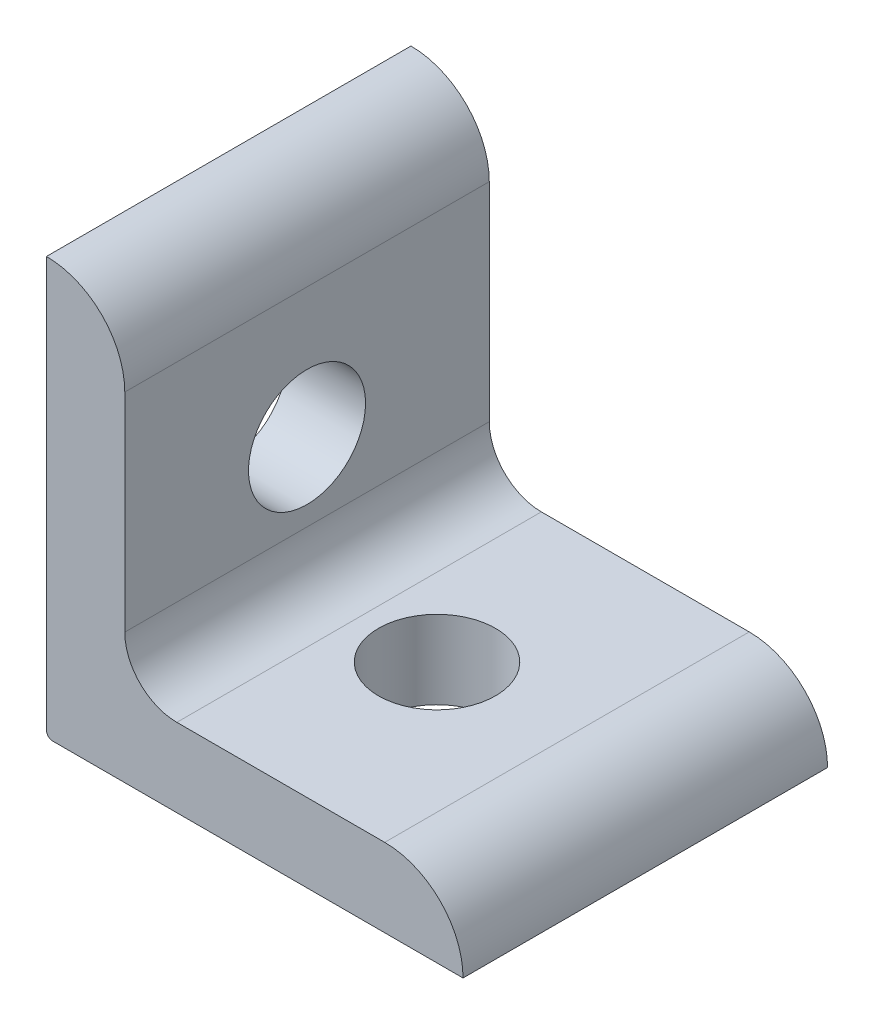
ISO-10303-21;
HEADER;
FILE_DESCRIPTION(('STEP AP214'),'2;1');
FILE_NAME('part.step','',(''),(''),'','','');
FILE_SCHEMA(('AUTOMOTIVE_DESIGN { 1 0 10303 214 1 1 1 1 }'));
ENDSEC;
DATA;
#1=APPLICATION_CONTEXT('core data for automotive mechanical design processes');
#2=APPLICATION_PROTOCOL_DEFINITION('international standard','automotive_design',2000,#1);
#3=PRODUCT_CONTEXT('',#1,'mechanical');
#4=PRODUCT('Part','Part','',(#3));
#5=PRODUCT_RELATED_PRODUCT_CATEGORY('part','',(#4));
#6=PRODUCT_DEFINITION_FORMATION('','',#4);
#7=PRODUCT_DEFINITION_CONTEXT('part definition',#1,'design');
#8=PRODUCT_DEFINITION('design','',#6,#7);
#9=PRODUCT_DEFINITION_SHAPE('','',#8);
#10=(LENGTH_UNIT() NAMED_UNIT(*) SI_UNIT(.MILLI.,.METRE.));
#11=(NAMED_UNIT(*) PLANE_ANGLE_UNIT() SI_UNIT($,.RADIAN.));
#12=(NAMED_UNIT(*) SI_UNIT($,.STERADIAN.) SOLID_ANGLE_UNIT());
#13=UNCERTAINTY_MEASURE_WITH_UNIT(LENGTH_MEASURE(1.E-05),#10,'distance_accuracy_value','');
#14=(GEOMETRIC_REPRESENTATION_CONTEXT(3) GLOBAL_UNCERTAINTY_ASSIGNED_CONTEXT((#13)) GLOBAL_UNIT_ASSIGNED_CONTEXT((#10,
#11,#12)) REPRESENTATION_CONTEXT('',''));
#15=CARTESIAN_POINT('',(0.,0.,0.));
#16=DIRECTION('',(0.,0.,1.));
#17=DIRECTION('',(1.,0.,0.));
#18=AXIS2_PLACEMENT_3D('',#15,#16,#17);
#19=CARTESIAN_POINT('',(20.6248,-9.25533389722021E-11,0.));
#20=DIRECTION('',(0.,0.,-1.));
#21=DIRECTION('',(-1.,0.,0.));
#22=AXIS2_PLACEMENT_3D('',#19,#20,#21);
#23=CYLINDRICAL_SURFACE('',#22,4.7752);
#24=CARTESIAN_POINT('',(20.6248,-9.25533389722021E-11,-22.225));
#25=DIRECTION('',(0.,0.,-1.));
#26=DIRECTION('',(-1.,0.,0.));
#27=AXIS2_PLACEMENT_3D('',#24,#25,#26);
#28=CIRCLE('',#27,4.7752);
#29=CARTESIAN_POINT('',(20.6248,4.77519999990745,-22.225));
#30=VERTEX_POINT('',#29);
#31=CARTESIAN_POINT('',(25.4,-9.25533389722021E-11,-22.225));
#32=VERTEX_POINT('',#31);
#33=EDGE_CURVE('E138',#30,#32,#28,.T.);
#34=ORIENTED_EDGE('',*,*,#33,.F.);
#35=DIRECTION('',(0.,0.,-1.));
#36=VECTOR('',#35,1.);
#37=CARTESIAN_POINT('',(20.6248,4.77519999990745,0.));
#38=LINE('',#37,#36);
#39=CARTESIAN_POINT('',(20.6248,4.77519999990745,0.));
#40=VERTEX_POINT('',#39);
#41=EDGE_CURVE('E121',#40,#30,#38,.T.);
#42=ORIENTED_EDGE('',*,*,#41,.F.);
#43=CARTESIAN_POINT('',(20.6248,-9.25533389722021E-11,0.));
#44=DIRECTION('',(0.,0.,-1.));
#45=DIRECTION('',(-1.,0.,0.));
#46=AXIS2_PLACEMENT_3D('',#43,#44,#45);
#47=CIRCLE('',#46,4.7752);
#48=CARTESIAN_POINT('',(25.4,-9.25533389722021E-11,0.));
#49=VERTEX_POINT('',#48);
#50=EDGE_CURVE('E114',#40,#49,#47,.T.);
#51=ORIENTED_EDGE('',*,*,#50,.T.);
#52=DIRECTION('',(0.,0.,-1.));
#53=VECTOR('',#52,1.);
#54=CARTESIAN_POINT('',(25.4,-9.25533389722021E-11,0.));
#55=LINE('',#54,#53);
#56=EDGE_CURVE('E95',#49,#32,#55,.T.);
#57=ORIENTED_EDGE('',*,*,#56,.T.);
#58=EDGE_LOOP('',(#34,#42,#51,#57));
#59=FACE_BOUND('',#58,.T.);
#60=ADVANCED_FACE('F32',(#59),#23,.T.);
#61=CARTESIAN_POINT('',(4.77520000003089,4.77519999990745,0.));
#62=DIRECTION('',(0.,1.,0.));
#63=DIRECTION('',(-1.,0.,0.));
#64=AXIS2_PLACEMENT_3D('',#61,#62,#63);
#65=PLANE('',#64);
#66=CARTESIAN_POINT('',(12.7,4.77519999990745,-11.1125));
#67=DIRECTION('',(0.,1.,0.));
#68=DIRECTION('',(0.,0.,1.));
#69=AXIS2_PLACEMENT_3D('',#66,#67,#68);
#70=CIRCLE('',#69,3.56870000000001);
#71=CARTESIAN_POINT('',(12.7,4.77519999990745,-7.54379999999999));
#72=VERTEX_POINT('',#71);
#73=EDGE_CURVE('E224',#72,#72,#70,.T.);
#74=ORIENTED_EDGE('',*,*,#73,.F.);
#75=EDGE_LOOP('',(#74));
#76=FACE_BOUND('',#75,.T.);
#77=DIRECTION('',(1.,0.,0.));
#78=VECTOR('',#77,1.);
#79=CARTESIAN_POINT('',(4.77520000003089,4.77519999990745,-22.225));
#80=LINE('',#79,#78);
#81=CARTESIAN_POINT('',(7.95020000003089,4.77519999990745,-22.225));
#82=VERTEX_POINT('',#81);
#83=EDGE_CURVE('E122',#82,#30,#80,.T.);
#84=ORIENTED_EDGE('',*,*,#83,.F.);
#85=DIRECTION('',(0.,0.,-1.));
#86=VECTOR('',#85,1.);
#87=CARTESIAN_POINT('',(7.95020000003089,4.77519999990745,0.));
#88=LINE('',#87,#86);
#89=CARTESIAN_POINT('',(7.95020000003089,4.77519999990745,0.));
#90=VERTEX_POINT('',#89);
#91=EDGE_CURVE('E47',#82,#90,#88,.F.);
#92=ORIENTED_EDGE('',*,*,#91,.T.);
#93=DIRECTION('',(1.,0.,0.));
#94=VECTOR('',#93,1.);
#95=CARTESIAN_POINT('',(4.77520000003089,4.77519999990745,0.));
#96=LINE('',#95,#94);
#97=EDGE_CURVE('E108',#90,#40,#96,.T.);
#98=ORIENTED_EDGE('',*,*,#97,.T.);
#99=ORIENTED_EDGE('',*,*,#41,.T.);
#100=EDGE_LOOP('',(#84,#92,#98,#99));
#101=FACE_BOUND('',#100,.T.);
#102=ADVANCED_FACE('F184',(#76,#101),#65,.T.);
#103=CARTESIAN_POINT('',(4.77520000003089,20.6247999999691,0.));
#104=DIRECTION('',(1.,0.,0.));
#105=DIRECTION('',(0.,1.,0.));
#106=AXIS2_PLACEMENT_3D('',#103,#104,#105);
#107=PLANE('',#106);
#108=CARTESIAN_POINT('',(4.77520000003089,12.6999999999691,-11.1125));
#109=DIRECTION('',(1.,0.,0.));
#110=DIRECTION('',(0.,0.,-1.));
#111=AXIS2_PLACEMENT_3D('',#108,#109,#110);
#112=CIRCLE('',#111,3.56870000000001);
#113=CARTESIAN_POINT('',(4.77520000003089,12.6999999999691,-14.6812));
#114=VERTEX_POINT('',#113);
#115=EDGE_CURVE('E222',#114,#114,#112,.T.);
#116=ORIENTED_EDGE('',*,*,#115,.F.);
#117=EDGE_LOOP('',(#116));
#118=FACE_BOUND('',#117,.T.);
#119=DIRECTION('',(0.,-1.,0.));
#120=VECTOR('',#119,1.);
#121=CARTESIAN_POINT('',(4.77520000003089,20.6247999999691,0.));
#122=LINE('',#121,#120);
#123=CARTESIAN_POINT('',(4.77520000003089,20.6247999999691,0.));
#124=VERTEX_POINT('',#123);
#125=CARTESIAN_POINT('',(4.77520000003089,7.95019999990745,0.));
#126=VERTEX_POINT('',#125);
#127=EDGE_CURVE('E134',#124,#126,#122,.T.);
#128=ORIENTED_EDGE('',*,*,#127,.T.);
#129=DIRECTION('',(0.,0.,-1.));
#130=VECTOR('',#129,1.);
#131=CARTESIAN_POINT('',(4.77520000003089,7.95019999990745,-22.225));
#132=LINE('',#131,#130);
#133=CARTESIAN_POINT('',(4.77520000003089,7.95019999990745,-22.225));
#134=VERTEX_POINT('',#133);
#135=EDGE_CURVE('E159',#126,#134,#132,.T.);
#136=ORIENTED_EDGE('',*,*,#135,.T.);
#137=DIRECTION('',(0.,-1.,0.));
#138=VECTOR('',#137,1.);
#139=CARTESIAN_POINT('',(4.77520000003089,20.6247999999691,-22.225));
#140=LINE('',#139,#138);
#141=CARTESIAN_POINT('',(4.77520000003089,20.6247999999691,-22.225));
#142=VERTEX_POINT('',#141);
#143=EDGE_CURVE('E124',#142,#134,#140,.T.);
#144=ORIENTED_EDGE('',*,*,#143,.F.);
#145=DIRECTION('',(0.,0.,-1.));
#146=VECTOR('',#145,1.);
#147=CARTESIAN_POINT('',(4.77520000003089,20.6247999999691,0.));
#148=LINE('',#147,#146);
#149=EDGE_CURVE('E149',#124,#142,#148,.T.);
#150=ORIENTED_EDGE('',*,*,#149,.F.);
#151=EDGE_LOOP('',(#128,#136,#144,#150));
#152=FACE_BOUND('',#151,.T.);
#153=ADVANCED_FACE('F165',(#118,#152),#107,.T.);
#154=CARTESIAN_POINT('',(3.08890018003394E-11,20.6247999999691,0.));
#155=DIRECTION('',(0.,0.,-1.));
#156=DIRECTION('',(-1.,0.,0.));
#157=AXIS2_PLACEMENT_3D('',#154,#155,#156);
#158=CYLINDRICAL_SURFACE('',#157,4.7752);
#159=CARTESIAN_POINT('',(3.08890018003394E-11,20.6247999999691,-22.225));
#160=DIRECTION('',(0.,0.,-1.));
#161=DIRECTION('',(-1.,0.,0.));
#162=AXIS2_PLACEMENT_3D('',#159,#160,#161);
#163=CIRCLE('',#162,4.7752);
#164=CARTESIAN_POINT('',(3.08890018003394E-11,25.3999999999691,-22.225));
#165=VERTEX_POINT('',#164);
#166=EDGE_CURVE('E143',#165,#142,#163,.T.);
#167=ORIENTED_EDGE('',*,*,#166,.F.);
#168=DIRECTION('',(0.,0.,-1.));
#169=VECTOR('',#168,1.);
#170=CARTESIAN_POINT('',(3.08890018003394E-11,25.3999999999691,0.));
#171=LINE('',#170,#169);
#172=CARTESIAN_POINT('',(3.08890018003394E-11,25.3999999999691,0.));
#173=VERTEX_POINT('',#172);
#174=EDGE_CURVE('E107',#173,#165,#171,.T.);
#175=ORIENTED_EDGE('',*,*,#174,.F.);
#176=CARTESIAN_POINT('',(3.08890018003394E-11,20.6247999999691,0.));
#177=DIRECTION('',(0.,0.,-1.));
#178=DIRECTION('',(-1.,0.,0.));
#179=AXIS2_PLACEMENT_3D('',#176,#177,#178);
#180=CIRCLE('',#179,4.7752);
#181=EDGE_CURVE('E131',#173,#124,#180,.T.);
#182=ORIENTED_EDGE('',*,*,#181,.T.);
#183=ORIENTED_EDGE('',*,*,#149,.T.);
#184=EDGE_LOOP('',(#167,#175,#182,#183));
#185=FACE_BOUND('',#184,.T.);
#186=ADVANCED_FACE('F174',(#185),#158,.T.);
#187=CARTESIAN_POINT('',(3.0888486213243E-11,-9.25533389722021E-11,0.));
#188=DIRECTION('',(-1.,0.,0.));
#189=DIRECTION('',(0.,-1.,0.));
#190=AXIS2_PLACEMENT_3D('',#187,#188,#189);
#191=PLANE('',#190);
#192=CARTESIAN_POINT('',(3.0887618851505E-11,12.6999999999691,-11.1125));
#193=DIRECTION('',(1.,0.,0.));
#194=DIRECTION('',(0.,0.,-1.));
#195=AXIS2_PLACEMENT_3D('',#192,#193,#194);
#196=CIRCLE('',#195,3.56870000000001);
#197=CARTESIAN_POINT('',(3.0887618851505E-11,12.6999999999691,-14.6812));
#198=VERTEX_POINT('',#197);
#199=EDGE_CURVE('E219',#198,#198,#196,.T.);
#200=ORIENTED_EDGE('',*,*,#199,.T.);
#201=EDGE_LOOP('',(#200));
#202=FACE_BOUND('',#201,.T.);
#203=DIRECTION('',(0.,1.,0.));
#204=VECTOR('',#203,1.);
#205=CARTESIAN_POINT('',(3.0888486213243E-11,-9.25533389722021E-11,-22.225));
#206=LINE('',#205,#204);
#207=CARTESIAN_POINT('',(3.08884939470495E-11,0.380999999907447,-22.225));
#208=VERTEX_POINT('',#207);
#209=EDGE_CURVE('E141',#208,#165,#206,.T.);
#210=ORIENTED_EDGE('',*,*,#209,.F.);
#211=DIRECTION('',(0.,0.,-1.));
#212=VECTOR('',#211,1.);
#213=CARTESIAN_POINT('',(3.08884939470495E-11,0.380999999907447,0.));
#214=LINE('',#213,#212);
#215=CARTESIAN_POINT('',(3.08884939470495E-11,0.380999999907447,0.));
#216=VERTEX_POINT('',#215);
#217=EDGE_CURVE('E156',#208,#216,#214,.F.);
#218=ORIENTED_EDGE('',*,*,#217,.T.);
#219=DIRECTION('',(0.,1.,0.));
#220=VECTOR('',#219,1.);
#221=CARTESIAN_POINT('',(3.0888486213243E-11,-9.25533389722021E-11,0.));
#222=LINE('',#221,#220);
#223=EDGE_CURVE('E117',#216,#173,#222,.T.);
#224=ORIENTED_EDGE('',*,*,#223,.T.);
#225=ORIENTED_EDGE('',*,*,#174,.T.);
#226=EDGE_LOOP('',(#210,#218,#224,#225));
#227=FACE_BOUND('',#226,.T.);
#228=ADVANCED_FACE('F194',(#202,#227),#191,.T.);
#229=CARTESIAN_POINT('',(25.4,-9.25533389722021E-11,0.));
#230=DIRECTION('',(0.,-1.,0.));
#231=DIRECTION('',(0.,0.,-1.));
#232=AXIS2_PLACEMENT_3D('',#229,#230,#231);
#233=PLANE('',#232);
#234=CARTESIAN_POINT('',(12.7,-9.25535689755286E-11,-11.1125));
#235=DIRECTION('',(0.,1.,0.));
#236=DIRECTION('',(0.,0.,1.));
#237=AXIS2_PLACEMENT_3D('',#234,#235,#236);
#238=CIRCLE('',#237,3.56870000000001);
#239=CARTESIAN_POINT('',(12.7,-9.25535689755286E-11,-7.54379999999999));
#240=VERTEX_POINT('',#239);
#241=EDGE_CURVE('E127',#240,#240,#238,.T.);
#242=ORIENTED_EDGE('',*,*,#241,.T.);
#243=EDGE_LOOP('',(#242));
#244=FACE_BOUND('',#243,.T.);
#245=DIRECTION('',(-1.,0.,0.));
#246=VECTOR('',#245,1.);
#247=CARTESIAN_POINT('',(25.4,-9.25533389722021E-11,0.));
#248=LINE('',#247,#246);
#249=CARTESIAN_POINT('',(0.381000000030888,-9.25533389722021E-11,0.));
#250=VERTEX_POINT('',#249);
#251=EDGE_CURVE('E99',#49,#250,#248,.T.);
#252=ORIENTED_EDGE('',*,*,#251,.T.);
#253=DIRECTION('',(0.,0.,-1.));
#254=VECTOR('',#253,1.);
#255=CARTESIAN_POINT('',(0.381000000030888,-9.25533389722021E-11,0.));
#256=LINE('',#255,#254);
#257=CARTESIAN_POINT('',(0.381000000030888,-9.25533389722021E-11,-22.225));
#258=VERTEX_POINT('',#257);
#259=EDGE_CURVE('E148',#250,#258,#256,.T.);
#260=ORIENTED_EDGE('',*,*,#259,.T.);
#261=DIRECTION('',(-1.,0.,0.));
#262=VECTOR('',#261,1.);
#263=CARTESIAN_POINT('',(25.4,-9.25533389722021E-11,-22.225));
#264=LINE('',#263,#262);
#265=EDGE_CURVE('E102',#32,#258,#264,.T.);
#266=ORIENTED_EDGE('',*,*,#265,.F.);
#267=ORIENTED_EDGE('',*,*,#56,.F.);
#268=EDGE_LOOP('',(#252,#260,#266,#267));
#269=FACE_BOUND('',#268,.T.);
#270=ADVANCED_FACE('F97',(#244,#269),#233,.T.);
#271=CARTESIAN_POINT('',(20.6248,-9.25533389722021E-11,0.));
#272=DIRECTION('',(0.,0.,-1.));
#273=DIRECTION('',(-1.,0.,0.));
#274=AXIS2_PLACEMENT_3D('',#271,#272,#273);
#275=PLANE('',#274);
#276=ORIENTED_EDGE('',*,*,#223,.F.);
#277=CARTESIAN_POINT('',(0.381000000030888,0.380999999907447,0.));
#278=DIRECTION('',(0.,0.,-1.));
#279=DIRECTION('',(-1.,0.,0.));
#280=AXIS2_PLACEMENT_3D('',#277,#278,#279);
#281=CIRCLE('',#280,0.381);
#282=EDGE_CURVE('E116',#216,#250,#281,.F.);
#283=ORIENTED_EDGE('',*,*,#282,.T.);
#284=ORIENTED_EDGE('',*,*,#251,.F.);
#285=ORIENTED_EDGE('',*,*,#50,.F.);
#286=ORIENTED_EDGE('',*,*,#97,.F.);
#287=CARTESIAN_POINT('',(7.95020000003089,7.95019999990745,0.));
#288=DIRECTION('',(0.,0.,-1.));
#289=DIRECTION('',(-1.,0.,0.));
#290=AXIS2_PLACEMENT_3D('',#287,#288,#289);
#291=CIRCLE('',#290,3.175);
#292=EDGE_CURVE('E11',#90,#126,#291,.T.);
#293=ORIENTED_EDGE('',*,*,#292,.T.);
#294=ORIENTED_EDGE('',*,*,#127,.F.);
#295=ORIENTED_EDGE('',*,*,#181,.F.);
#296=EDGE_LOOP('',(#276,#283,#284,#285,#286,#293,#294,#295));
#297=FACE_BOUND('',#296,.T.);
#298=ADVANCED_FACE('F113',(#297),#275,.F.);
#299=CARTESIAN_POINT('',(20.6248,-9.25533389722021E-11,-22.225));
#300=DIRECTION('',(0.,0.,-1.));
#301=DIRECTION('',(-1.,0.,0.));
#302=AXIS2_PLACEMENT_3D('',#299,#300,#301);
#303=PLANE('',#302);
#304=ORIENTED_EDGE('',*,*,#265,.T.);
#305=CARTESIAN_POINT('',(0.381000000030888,0.380999999907447,-22.225));
#306=DIRECTION('',(0.,0.,-1.));
#307=DIRECTION('',(-1.,0.,0.));
#308=AXIS2_PLACEMENT_3D('',#305,#306,#307);
#309=CIRCLE('',#308,0.381);
#310=EDGE_CURVE('E154',#258,#208,#309,.T.);
#311=ORIENTED_EDGE('',*,*,#310,.T.);
#312=ORIENTED_EDGE('',*,*,#209,.T.);
#313=ORIENTED_EDGE('',*,*,#166,.T.);
#314=ORIENTED_EDGE('',*,*,#143,.T.);
#315=CARTESIAN_POINT('',(7.95020000003089,7.95019999990745,-22.225));
#316=DIRECTION('',(0.,0.,-1.));
#317=DIRECTION('',(-1.,0.,0.));
#318=AXIS2_PLACEMENT_3D('',#315,#316,#317);
#319=CIRCLE('',#318,3.175);
#320=EDGE_CURVE('E40',#134,#82,#319,.F.);
#321=ORIENTED_EDGE('',*,*,#320,.T.);
#322=ORIENTED_EDGE('',*,*,#83,.T.);
#323=ORIENTED_EDGE('',*,*,#33,.T.);
#324=EDGE_LOOP('',(#304,#311,#312,#313,#314,#321,#322,#323));
#325=FACE_BOUND('',#324,.T.);
#326=ADVANCED_FACE('F169',(#325),#303,.T.);
#327=CARTESIAN_POINT('',(12.7,4.77519999990745,-11.1125));
#328=DIRECTION('',(0.,1.,0.));
#329=DIRECTION('',(0.,0.,1.));
#330=AXIS2_PLACEMENT_3D('',#327,#328,#329);
#331=CYLINDRICAL_SURFACE('',#330,3.56870000000001);
#332=ORIENTED_EDGE('',*,*,#241,.F.);
#333=EDGE_LOOP('',(#332));
#334=FACE_BOUND('',#333,.T.);
#335=ORIENTED_EDGE('',*,*,#73,.T.);
#336=EDGE_LOOP('',(#335));
#337=FACE_BOUND('',#336,.T.);
#338=ADVANCED_FACE('F206',(#334,#337),#331,.F.);
#339=CARTESIAN_POINT('',(4.77520000003089,12.6999999999691,-11.1125));
#340=DIRECTION('',(1.,0.,0.));
#341=DIRECTION('',(0.,0.,-1.));
#342=AXIS2_PLACEMENT_3D('',#339,#340,#341);
#343=CYLINDRICAL_SURFACE('',#342,3.56870000000001);
#344=ORIENTED_EDGE('',*,*,#199,.F.);
#345=EDGE_LOOP('',(#344));
#346=FACE_BOUND('',#345,.T.);
#347=ORIENTED_EDGE('',*,*,#115,.T.);
#348=EDGE_LOOP('',(#347));
#349=FACE_BOUND('',#348,.T.);
#350=ADVANCED_FACE('F181',(#346,#349),#343,.F.);
#351=CARTESIAN_POINT('',(0.381000000030888,0.380999999907447,0.));
#352=DIRECTION('',(0.,0.,-1.));
#353=DIRECTION('',(-1.,0.,0.));
#354=AXIS2_PLACEMENT_3D('',#351,#352,#353);
#355=CYLINDRICAL_SURFACE('',#354,0.381);
#356=ORIENTED_EDGE('',*,*,#282,.F.);
#357=ORIENTED_EDGE('',*,*,#217,.F.);
#358=ORIENTED_EDGE('',*,*,#310,.F.);
#359=ORIENTED_EDGE('',*,*,#259,.F.);
#360=EDGE_LOOP('',(#356,#357,#358,#359));
#361=FACE_BOUND('',#360,.T.);
#362=ADVANCED_FACE('F177',(#361),#355,.T.);
#363=CARTESIAN_POINT('',(7.95020000003089,7.95019999990745,0.));
#364=DIRECTION('',(0.,0.,1.));
#365=DIRECTION('',(1.,0.,0.));
#366=AXIS2_PLACEMENT_3D('',#363,#364,#365);
#367=CYLINDRICAL_SURFACE('',#366,3.175);
#368=ORIENTED_EDGE('',*,*,#292,.F.);
#369=ORIENTED_EDGE('',*,*,#91,.F.);
#370=ORIENTED_EDGE('',*,*,#320,.F.);
#371=ORIENTED_EDGE('',*,*,#135,.F.);
#372=EDGE_LOOP('',(#368,#369,#370,#371));
#373=FACE_BOUND('',#372,.T.);
#374=ADVANCED_FACE('F34',(#373),#367,.F.);
#375=CLOSED_SHELL('',(#60,#102,#153,#186,#228,#270,#298,#326,#338,#350,#362,#374));
#376=MANIFOLD_SOLID_BREP('B2',#375);
#377=ADVANCED_BREP_SHAPE_REPRESENTATION('',(#18,#376),#14);
#378=SHAPE_DEFINITION_REPRESENTATION(#9,#377);
ENDSEC;
END-ISO-10303-21;
